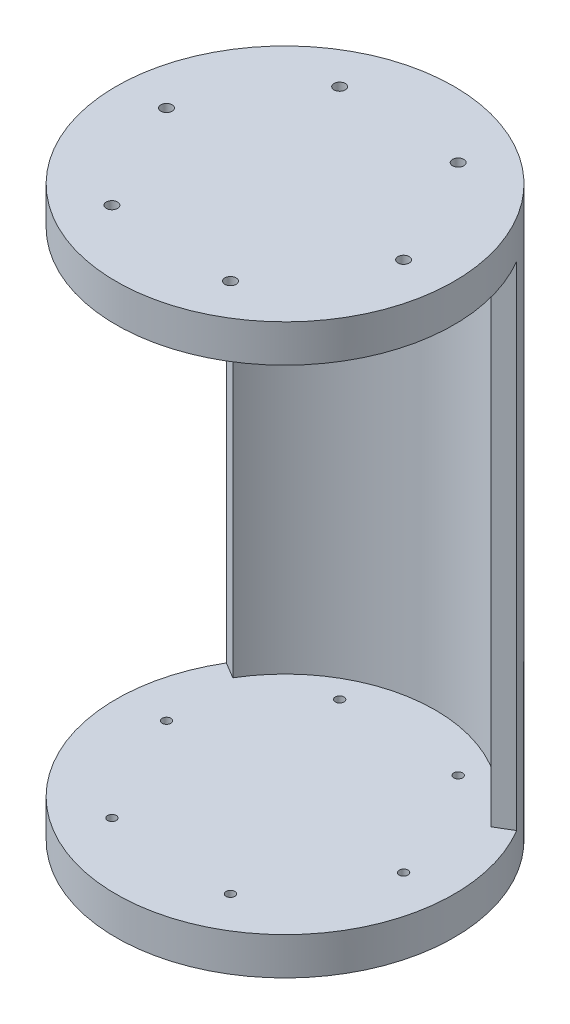
ISO-10303-21;
HEADER;
FILE_DESCRIPTION(('STEP AP214'),'2;1');
FILE_NAME('part.step','',(''),(''),'','','');
FILE_SCHEMA(('AUTOMOTIVE_DESIGN { 1 0 10303 214 1 1 1 1 }'));
ENDSEC;
DATA;
#1=APPLICATION_CONTEXT('core data for automotive mechanical design processes');
#2=APPLICATION_PROTOCOL_DEFINITION('international standard','automotive_design',2000,#1);
#3=PRODUCT_CONTEXT('',#1,'mechanical');
#4=PRODUCT('Part','Part','',(#3));
#5=PRODUCT_RELATED_PRODUCT_CATEGORY('part','',(#4));
#6=PRODUCT_DEFINITION_FORMATION('','',#4);
#7=PRODUCT_DEFINITION_CONTEXT('part definition',#1,'design');
#8=PRODUCT_DEFINITION('design','',#6,#7);
#9=PRODUCT_DEFINITION_SHAPE('','',#8);
#10=(LENGTH_UNIT() NAMED_UNIT(*) SI_UNIT(.MILLI.,.METRE.));
#11=(NAMED_UNIT(*) PLANE_ANGLE_UNIT() SI_UNIT($,.RADIAN.));
#12=(NAMED_UNIT(*) SI_UNIT($,.STERADIAN.) SOLID_ANGLE_UNIT());
#13=UNCERTAINTY_MEASURE_WITH_UNIT(LENGTH_MEASURE(1.E-05),#10,'distance_accuracy_value','');
#14=(GEOMETRIC_REPRESENTATION_CONTEXT(3) GLOBAL_UNCERTAINTY_ASSIGNED_CONTEXT((#13)) GLOBAL_UNIT_ASSIGNED_CONTEXT((#10,
#11,#12)) REPRESENTATION_CONTEXT('',''));
#15=CARTESIAN_POINT('',(0.,0.,0.));
#16=DIRECTION('',(0.,0.,1.));
#17=DIRECTION('',(1.,0.,0.));
#18=AXIS2_PLACEMENT_3D('',#15,#16,#17);
#19=CARTESIAN_POINT('',(0.,197.,0.));
#20=DIRECTION('',(-0.511664206442225,0.,-0.859185509564639));
#21=DIRECTION('',(-0.859185509564639,0.,0.511664206442225));
#22=AXIS2_PLACEMENT_3D('',#19,#20,#21);
#23=PLANE('',#22);
#24=DIRECTION('',(0.859185509564639,0.,-0.511664206442225));
#25=VECTOR('',#24,1.);
#26=CARTESIAN_POINT('',(0.,0.,0.));
#27=LINE('',#26,#25);
#28=CARTESIAN_POINT('',(51.5511305738783,0.,-30.6998523865335));
#29=VERTEX_POINT('',#28);
#30=CARTESIAN_POINT('',(57.9950218956131,0.,-34.5373339348502));
#31=VERTEX_POINT('',#30);
#32=EDGE_CURVE('E87',#29,#31,#27,.T.);
#33=ORIENTED_EDGE('',*,*,#32,.T.);
#34=DIRECTION('',(0.,-1.,0.));
#35=VECTOR('',#34,1.);
#36=CARTESIAN_POINT('',(57.9950218956131,197.,-34.5373339348502));
#37=LINE('',#36,#35);
#38=CARTESIAN_POINT('',(57.9950218956131,197.,-34.5373339348502));
#39=VERTEX_POINT('',#38);
#40=EDGE_CURVE('E11',#39,#31,#37,.T.);
#41=ORIENTED_EDGE('',*,*,#40,.F.);
#42=DIRECTION('',(0.859185509564639,0.,-0.511664206442225));
#43=VECTOR('',#42,1.);
#44=CARTESIAN_POINT('',(0.,197.,0.));
#45=LINE('',#44,#43);
#46=CARTESIAN_POINT('',(51.5511305738783,197.,-30.6998523865335));
#47=VERTEX_POINT('',#46);
#48=EDGE_CURVE('E91',#47,#39,#45,.T.);
#49=ORIENTED_EDGE('',*,*,#48,.F.);
#50=DIRECTION('',(0.,-1.,0.));
#51=VECTOR('',#50,1.);
#52=CARTESIAN_POINT('',(51.5511305738783,197.,-30.6998523865335));
#53=LINE('',#52,#51);
#54=EDGE_CURVE('E77',#47,#29,#53,.T.);
#55=ORIENTED_EDGE('',*,*,#54,.T.);
#56=EDGE_LOOP('',(#33,#41,#49,#55));
#57=FACE_BOUND('',#56,.T.);
#58=ADVANCED_FACE('F38',(#57),#23,.F.);
#59=CARTESIAN_POINT('',(0.,197.,0.));
#60=DIRECTION('',(0.,-1.,0.));
#61=DIRECTION('',(0.,0.,-1.));
#62=AXIS2_PLACEMENT_3D('',#59,#60,#61);
#63=CYLINDRICAL_SURFACE('',#62,67.5);
#64=CARTESIAN_POINT('',(0.,0.,0.));
#65=DIRECTION('',(0.,-1.,0.));
#66=DIRECTION('',(0.,0.,-1.));
#67=AXIS2_PLACEMENT_3D('',#64,#65,#66);
#68=CIRCLE('',#67,67.5);
#69=CARTESIAN_POINT('',(-57.9950218956131,0.,-34.5373339348502));
#70=VERTEX_POINT('',#69);
#71=EDGE_CURVE('E211',#31,#70,#68,.T.);
#72=ORIENTED_EDGE('',*,*,#71,.T.);
#73=DIRECTION('',(0.,-1.,0.));
#74=VECTOR('',#73,1.);
#75=CARTESIAN_POINT('',(-57.9950218956131,197.,-34.5373339348502));
#76=LINE('',#75,#74);
#77=CARTESIAN_POINT('',(-57.9950218956131,197.,-34.5373339348502));
#78=VERTEX_POINT('',#77);
#79=EDGE_CURVE('E47',#78,#70,#76,.T.);
#80=ORIENTED_EDGE('',*,*,#79,.F.);
#81=CARTESIAN_POINT('',(0.,197.,0.));
#82=DIRECTION('',(0.,-1.,0.));
#83=DIRECTION('',(0.,0.,-1.));
#84=AXIS2_PLACEMENT_3D('',#81,#82,#83);
#85=CIRCLE('',#84,67.5);
#86=EDGE_CURVE('E152',#39,#78,#85,.T.);
#87=ORIENTED_EDGE('',*,*,#86,.F.);
#88=ORIENTED_EDGE('',*,*,#40,.T.);
#89=EDGE_LOOP('',(#72,#80,#87,#88));
#90=FACE_BOUND('',#89,.T.);
#91=CARTESIAN_POINT('',(0.,-15.,0.));
#92=DIRECTION('',(0.,-1.,0.));
#93=DIRECTION('',(0.,0.,-1.));
#94=AXIS2_PLACEMENT_3D('',#91,#92,#93);
#95=CIRCLE('',#94,67.5);
#96=CARTESIAN_POINT('',(0.,-15.,-67.5));
#97=VERTEX_POINT('',#96);
#98=EDGE_CURVE('E214',#97,#97,#95,.T.);
#99=ORIENTED_EDGE('',*,*,#98,.F.);
#100=EDGE_LOOP('',(#99));
#101=FACE_BOUND('',#100,.T.);
#102=CARTESIAN_POINT('',(0.,212.,0.));
#103=DIRECTION('',(0.,-1.,0.));
#104=DIRECTION('',(0.,0.,-1.));
#105=AXIS2_PLACEMENT_3D('',#102,#103,#104);
#106=CIRCLE('',#105,67.5);
#107=CARTESIAN_POINT('',(0.,212.,-67.5));
#108=VERTEX_POINT('',#107);
#109=EDGE_CURVE('E157',#108,#108,#106,.T.);
#110=ORIENTED_EDGE('',*,*,#109,.T.);
#111=EDGE_LOOP('',(#110));
#112=FACE_BOUND('',#111,.T.);
#113=ADVANCED_FACE('F224',(#90,#101,#112),#63,.T.);
#114=CARTESIAN_POINT('',(0.,197.,0.));
#115=DIRECTION('',(-0.511664206442225,0.,0.859185509564639));
#116=DIRECTION('',(0.859185509564639,0.,0.511664206442225));
#117=AXIS2_PLACEMENT_3D('',#114,#115,#116);
#118=PLANE('',#117);
#119=DIRECTION('',(-0.859185509564639,0.,-0.511664206442225));
#120=VECTOR('',#119,1.);
#121=CARTESIAN_POINT('',(0.,0.,0.));
#122=LINE('',#121,#120);
#123=CARTESIAN_POINT('',(-51.5511305738783,0.,-30.6998523865335));
#124=VERTEX_POINT('',#123);
#125=EDGE_CURVE('E81',#124,#70,#122,.T.);
#126=ORIENTED_EDGE('',*,*,#125,.F.);
#127=DIRECTION('',(0.,-1.,0.));
#128=VECTOR('',#127,1.);
#129=CARTESIAN_POINT('',(-51.5511305738783,197.,-30.6998523865335));
#130=LINE('',#129,#128);
#131=CARTESIAN_POINT('',(-51.5511305738783,197.,-30.6998523865335));
#132=VERTEX_POINT('',#131);
#133=EDGE_CURVE('E68',#132,#124,#130,.T.);
#134=ORIENTED_EDGE('',*,*,#133,.F.);
#135=DIRECTION('',(-0.859185509564639,0.,-0.511664206442225));
#136=VECTOR('',#135,1.);
#137=CARTESIAN_POINT('',(0.,197.,0.));
#138=LINE('',#137,#136);
#139=EDGE_CURVE('E55',#132,#78,#138,.T.);
#140=ORIENTED_EDGE('',*,*,#139,.T.);
#141=ORIENTED_EDGE('',*,*,#79,.T.);
#142=EDGE_LOOP('',(#126,#134,#140,#141));
#143=FACE_BOUND('',#142,.T.);
#144=ADVANCED_FACE('F82',(#143),#118,.T.);
#145=CARTESIAN_POINT('',(0.,197.,0.));
#146=DIRECTION('',(0.,-1.,0.));
#147=DIRECTION('',(0.,0.,-1.));
#148=AXIS2_PLACEMENT_3D('',#145,#146,#147);
#149=CYLINDRICAL_SURFACE('',#148,60.);
#150=CARTESIAN_POINT('',(0.,0.,0.));
#151=DIRECTION('',(0.,1.,0.));
#152=DIRECTION('',(0.,0.,1.));
#153=AXIS2_PLACEMENT_3D('',#150,#151,#152);
#154=CIRCLE('',#153,60.);
#155=EDGE_CURVE('E73',#29,#124,#154,.T.);
#156=ORIENTED_EDGE('',*,*,#155,.F.);
#157=ORIENTED_EDGE('',*,*,#54,.F.);
#158=CARTESIAN_POINT('',(0.,197.,0.));
#159=DIRECTION('',(0.,1.,0.));
#160=DIRECTION('',(0.,0.,1.));
#161=AXIS2_PLACEMENT_3D('',#158,#159,#160);
#162=CIRCLE('',#161,60.);
#163=EDGE_CURVE('E75',#47,#132,#162,.T.);
#164=ORIENTED_EDGE('',*,*,#163,.T.);
#165=ORIENTED_EDGE('',*,*,#133,.T.);
#166=EDGE_LOOP('',(#156,#157,#164,#165));
#167=FACE_BOUND('',#166,.T.);
#168=ADVANCED_FACE('F70',(#167),#149,.F.);
#169=CARTESIAN_POINT('',(0.,-15.,0.));
#170=DIRECTION('',(0.,-1.,0.));
#171=DIRECTION('',(0.,0.,-1.));
#172=AXIS2_PLACEMENT_3D('',#169,#170,#171);
#173=PLANE('',#172);
#174=CARTESIAN_POINT('',(-27.20568798596,-15.,41.9505725969314));
#175=DIRECTION('',(0.,-1.,0.));
#176=DIRECTION('',(0.,0.,-1.));
#177=AXIS2_PLACEMENT_3D('',#174,#175,#176);
#178=CIRCLE('',#177,2.25);
#179=CARTESIAN_POINT('',(-27.20568798596,-15.,39.7005725969314));
#180=VERTEX_POINT('',#179);
#181=EDGE_CURVE('E118',#180,#180,#178,.T.);
#182=ORIENTED_EDGE('',*,*,#181,.F.);
#183=EDGE_LOOP('',(#182));
#184=FACE_BOUND('',#183,.T.);
#185=CARTESIAN_POINT('',(-49.9331055652258,-15.,-2.58553062481088));
#186=DIRECTION('',(0.,-1.,0.));
#187=DIRECTION('',(0.,0.,-1.));
#188=AXIS2_PLACEMENT_3D('',#185,#186,#187);
#189=CIRCLE('',#188,2.25);
#190=CARTESIAN_POINT('',(-49.9331055652258,-15.,-4.83553062481088));
#191=VERTEX_POINT('',#190);
#192=EDGE_CURVE('E200',#191,#191,#189,.T.);
#193=ORIENTED_EDGE('',*,*,#192,.F.);
#194=EDGE_LOOP('',(#193));
#195=FACE_BOUND('',#194,.T.);
#196=CARTESIAN_POINT('',(-22.727417579264,-15.,-44.5361032217432));
#197=DIRECTION('',(0.,-1.,0.));
#198=DIRECTION('',(0.,0.,-1.));
#199=AXIS2_PLACEMENT_3D('',#196,#197,#198);
#200=CIRCLE('',#199,2.25);
#201=CARTESIAN_POINT('',(-22.727417579264,-15.,-46.7861032217432));
#202=VERTEX_POINT('',#201);
#203=EDGE_CURVE('E194',#202,#202,#200,.T.);
#204=ORIENTED_EDGE('',*,*,#203,.F.);
#205=EDGE_LOOP('',(#204));
#206=FACE_BOUND('',#205,.T.);
#207=CARTESIAN_POINT('',(27.2056879859637,-15.,-41.9505725969333));
#208=DIRECTION('',(0.,-1.,0.));
#209=DIRECTION('',(0.,0.,-1.));
#210=AXIS2_PLACEMENT_3D('',#207,#208,#209);
#211=CIRCLE('',#210,2.25);
#212=CARTESIAN_POINT('',(27.2056879859637,-15.,-44.2005725969333));
#213=VERTEX_POINT('',#212);
#214=EDGE_CURVE('E188',#213,#213,#211,.T.);
#215=ORIENTED_EDGE('',*,*,#214,.F.);
#216=EDGE_LOOP('',(#215));
#217=FACE_BOUND('',#216,.T.);
#218=CARTESIAN_POINT('',(49.9331055652296,-15.,2.58553062480892));
#219=DIRECTION('',(0.,-1.,0.));
#220=DIRECTION('',(0.,0.,-1.));
#221=AXIS2_PLACEMENT_3D('',#218,#219,#220);
#222=CIRCLE('',#221,2.25);
#223=CARTESIAN_POINT('',(49.9331055652296,-15.,0.335530624808916));
#224=VERTEX_POINT('',#223);
#225=EDGE_CURVE('E182',#224,#224,#222,.T.);
#226=ORIENTED_EDGE('',*,*,#225,.F.);
#227=EDGE_LOOP('',(#226));
#228=FACE_BOUND('',#227,.T.);
#229=CARTESIAN_POINT('',(22.7274175792677,-15.,44.5361032217413));
#230=DIRECTION('',(0.,-1.,0.));
#231=DIRECTION('',(0.,0.,-1.));
#232=AXIS2_PLACEMENT_3D('',#229,#230,#231);
#233=CIRCLE('',#232,2.25);
#234=CARTESIAN_POINT('',(22.7274175792677,-15.,42.2861032217413));
#235=VERTEX_POINT('',#234);
#236=EDGE_CURVE('E181',#235,#235,#233,.T.);
#237=ORIENTED_EDGE('',*,*,#236,.F.);
#238=EDGE_LOOP('',(#237));
#239=FACE_BOUND('',#238,.T.);
#240=ORIENTED_EDGE('',*,*,#98,.T.);
#241=EDGE_LOOP('',(#240));
#242=FACE_BOUND('',#241,.T.);
#243=ADVANCED_FACE('F259',(#184,#195,#206,#217,#228,#239,#242),#173,.T.);
#244=CARTESIAN_POINT('',(0.,0.,0.));
#245=DIRECTION('',(0.,-1.,0.));
#246=DIRECTION('',(0.,0.,-1.));
#247=AXIS2_PLACEMENT_3D('',#244,#245,#246);
#248=PLANE('',#247);
#249=CARTESIAN_POINT('',(-27.20568798596,0.,41.9505725969314));
#250=DIRECTION('',(0.,-1.,0.));
#251=DIRECTION('',(0.,0.,-1.));
#252=AXIS2_PLACEMENT_3D('',#249,#250,#251);
#253=CIRCLE('',#252,1.75000000000249);
#254=CARTESIAN_POINT('',(-27.20568798596,0.,40.2005725969289));
#255=VERTEX_POINT('',#254);
#256=EDGE_CURVE('E115',#255,#255,#253,.T.);
#257=ORIENTED_EDGE('',*,*,#256,.T.);
#258=EDGE_LOOP('',(#257));
#259=FACE_BOUND('',#258,.T.);
#260=CARTESIAN_POINT('',(-49.9331055652258,0.,-2.58553062481088));
#261=DIRECTION('',(0.,-1.,0.));
#262=DIRECTION('',(0.,0.,-1.));
#263=AXIS2_PLACEMENT_3D('',#260,#261,#262);
#264=CIRCLE('',#263,1.75000000000391);
#265=CARTESIAN_POINT('',(-49.9331055652258,0.,-4.33553062481479));
#266=VERTEX_POINT('',#265);
#267=EDGE_CURVE('E112',#266,#266,#264,.T.);
#268=ORIENTED_EDGE('',*,*,#267,.T.);
#269=EDGE_LOOP('',(#268));
#270=FACE_BOUND('',#269,.T.);
#271=CARTESIAN_POINT('',(-22.727417579264,0.,-44.5361032217432));
#272=DIRECTION('',(0.,-1.,0.));
#273=DIRECTION('',(0.,0.,-1.));
#274=AXIS2_PLACEMENT_3D('',#271,#272,#273);
#275=CIRCLE('',#274,1.75000000000327);
#276=CARTESIAN_POINT('',(-22.727417579264,0.,-46.2861032217465));
#277=VERTEX_POINT('',#276);
#278=EDGE_CURVE('E109',#277,#277,#275,.T.);
#279=ORIENTED_EDGE('',*,*,#278,.T.);
#280=EDGE_LOOP('',(#279));
#281=FACE_BOUND('',#280,.T.);
#282=CARTESIAN_POINT('',(27.2056879859637,0.,-41.9505725969333));
#283=DIRECTION('',(0.,-1.,0.));
#284=DIRECTION('',(0.,0.,-1.));
#285=AXIS2_PLACEMENT_3D('',#282,#283,#284);
#286=CIRCLE('',#285,1.75000000000115);
#287=CARTESIAN_POINT('',(27.2056879859637,0.,-43.7005725969345));
#288=VERTEX_POINT('',#287);
#289=EDGE_CURVE('E106',#288,#288,#286,.T.);
#290=ORIENTED_EDGE('',*,*,#289,.T.);
#291=EDGE_LOOP('',(#290));
#292=FACE_BOUND('',#291,.T.);
#293=CARTESIAN_POINT('',(49.9331055652296,0.,2.58553062480892));
#294=DIRECTION('',(0.,-1.,0.));
#295=DIRECTION('',(0.,0.,-1.));
#296=AXIS2_PLACEMENT_3D('',#293,#294,#295);
#297=CIRCLE('',#296,1.74999999999956);
#298=CARTESIAN_POINT('',(49.9331055652296,0.,0.835530624809363));
#299=VERTEX_POINT('',#298);
#300=EDGE_CURVE('E102',#299,#299,#297,.T.);
#301=ORIENTED_EDGE('',*,*,#300,.T.);
#302=EDGE_LOOP('',(#301));
#303=FACE_BOUND('',#302,.T.);
#304=CARTESIAN_POINT('',(22.7274175792677,0.,44.5361032217413));
#305=DIRECTION('',(0.,-1.,0.));
#306=DIRECTION('',(0.,0.,-1.));
#307=AXIS2_PLACEMENT_3D('',#304,#305,#306);
#308=CIRCLE('',#307,1.75);
#309=CARTESIAN_POINT('',(22.7274175792677,0.,42.7861032217413));
#310=VERTEX_POINT('',#309);
#311=EDGE_CURVE('E99',#310,#310,#308,.T.);
#312=ORIENTED_EDGE('',*,*,#311,.T.);
#313=EDGE_LOOP('',(#312));
#314=FACE_BOUND('',#313,.T.);
#315=ORIENTED_EDGE('',*,*,#32,.F.);
#316=ORIENTED_EDGE('',*,*,#155,.T.);
#317=ORIENTED_EDGE('',*,*,#125,.T.);
#318=ORIENTED_EDGE('',*,*,#71,.F.);
#319=EDGE_LOOP('',(#315,#316,#317,#318));
#320=FACE_BOUND('',#319,.T.);
#321=ADVANCED_FACE('F89',(#259,#270,#281,#292,#303,#314,#320),#248,.F.);
#322=CARTESIAN_POINT('',(22.7274175792677,-5.,44.5361032217413));
#323=DIRECTION('',(0.,-1.,0.));
#324=DIRECTION('',(0.,0.,-1.));
#325=AXIS2_PLACEMENT_3D('',#322,#323,#324);
#326=CYLINDRICAL_SURFACE('',#325,2.25);
#327=CARTESIAN_POINT('',(22.7274175792677,-5.,44.5361032217413));
#328=DIRECTION('',(0.,-1.,0.));
#329=DIRECTION('',(0.,0.,-1.));
#330=AXIS2_PLACEMENT_3D('',#327,#328,#329);
#331=CIRCLE('',#330,2.25);
#332=CARTESIAN_POINT('',(22.7274175792677,-5.,42.2861032217413));
#333=VERTEX_POINT('',#332);
#334=EDGE_CURVE('E208',#333,#333,#331,.T.);
#335=ORIENTED_EDGE('',*,*,#334,.F.);
#336=EDGE_LOOP('',(#335));
#337=FACE_BOUND('',#336,.T.);
#338=ORIENTED_EDGE('',*,*,#236,.T.);
#339=EDGE_LOOP('',(#338));
#340=FACE_BOUND('',#339,.T.);
#341=ADVANCED_FACE('F262',(#337,#340),#326,.F.);
#342=CARTESIAN_POINT('',(22.7274175792677,-5.,44.5361032217413));
#343=DIRECTION('',(0.,-1.,0.));
#344=DIRECTION('',(0.,0.,-1.));
#345=AXIS2_PLACEMENT_3D('',#342,#343,#344);
#346=PLANE('',#345);
#347=CARTESIAN_POINT('',(22.7274175792677,-5.,44.5361032217413));
#348=DIRECTION('',(0.,-1.,0.));
#349=DIRECTION('',(0.,0.,-1.));
#350=AXIS2_PLACEMENT_3D('',#347,#348,#349);
#351=CIRCLE('',#350,1.75);
#352=CARTESIAN_POINT('',(22.7274175792677,-5.,42.7861032217413));
#353=VERTEX_POINT('',#352);
#354=EDGE_CURVE('E103',#353,#353,#351,.T.);
#355=ORIENTED_EDGE('',*,*,#354,.F.);
#356=EDGE_LOOP('',(#355));
#357=FACE_BOUND('',#356,.T.);
#358=ORIENTED_EDGE('',*,*,#334,.T.);
#359=EDGE_LOOP('',(#358));
#360=FACE_BOUND('',#359,.T.);
#361=ADVANCED_FACE('F269',(#357,#360),#346,.T.);
#362=CARTESIAN_POINT('',(49.9331055652296,-5.,2.58553062480892));
#363=DIRECTION('',(0.,-1.,0.));
#364=DIRECTION('',(0.,0.,-1.));
#365=AXIS2_PLACEMENT_3D('',#362,#363,#364);
#366=CYLINDRICAL_SURFACE('',#365,2.25);
#367=CARTESIAN_POINT('',(49.9331055652296,-5.,2.58553062480892));
#368=DIRECTION('',(0.,-1.,0.));
#369=DIRECTION('',(0.,0.,-1.));
#370=AXIS2_PLACEMENT_3D('',#367,#368,#369);
#371=CIRCLE('',#370,2.25);
#372=CARTESIAN_POINT('',(49.9331055652296,-5.,0.335530624808916));
#373=VERTEX_POINT('',#372);
#374=EDGE_CURVE('E178',#373,#373,#371,.T.);
#375=ORIENTED_EDGE('',*,*,#374,.F.);
#376=EDGE_LOOP('',(#375));
#377=FACE_BOUND('',#376,.T.);
#378=ORIENTED_EDGE('',*,*,#225,.T.);
#379=EDGE_LOOP('',(#378));
#380=FACE_BOUND('',#379,.T.);
#381=ADVANCED_FACE('F273',(#377,#380),#366,.F.);
#382=CARTESIAN_POINT('',(49.9331055652296,-5.,2.58553062480892));
#383=DIRECTION('',(0.,-1.,0.));
#384=DIRECTION('',(0.,0.,-1.));
#385=AXIS2_PLACEMENT_3D('',#382,#383,#384);
#386=PLANE('',#385);
#387=CARTESIAN_POINT('',(49.9331055652296,-5.,2.58553062480892));
#388=DIRECTION('',(0.,-1.,0.));
#389=DIRECTION('',(0.,0.,-1.));
#390=AXIS2_PLACEMENT_3D('',#387,#388,#389);
#391=CIRCLE('',#390,1.74999999999956);
#392=CARTESIAN_POINT('',(49.9331055652296,-5.,0.835530624809363));
#393=VERTEX_POINT('',#392);
#394=EDGE_CURVE('E162',#393,#393,#391,.T.);
#395=ORIENTED_EDGE('',*,*,#394,.F.);
#396=EDGE_LOOP('',(#395));
#397=FACE_BOUND('',#396,.T.);
#398=ORIENTED_EDGE('',*,*,#374,.T.);
#399=EDGE_LOOP('',(#398));
#400=FACE_BOUND('',#399,.T.);
#401=ADVANCED_FACE('F304',(#397,#400),#386,.T.);
#402=CARTESIAN_POINT('',(27.2056879859637,-5.,-41.9505725969333));
#403=DIRECTION('',(0.,-1.,0.));
#404=DIRECTION('',(0.,0.,-1.));
#405=AXIS2_PLACEMENT_3D('',#402,#403,#404);
#406=CYLINDRICAL_SURFACE('',#405,2.25);
#407=CARTESIAN_POINT('',(27.2056879859637,-5.,-41.9505725969333));
#408=DIRECTION('',(0.,-1.,0.));
#409=DIRECTION('',(0.,0.,-1.));
#410=AXIS2_PLACEMENT_3D('',#407,#408,#409);
#411=CIRCLE('',#410,2.25);
#412=CARTESIAN_POINT('',(27.2056879859637,-5.,-44.2005725969333));
#413=VERTEX_POINT('',#412);
#414=EDGE_CURVE('E185',#413,#413,#411,.T.);
#415=ORIENTED_EDGE('',*,*,#414,.F.);
#416=EDGE_LOOP('',(#415));
#417=FACE_BOUND('',#416,.T.);
#418=ORIENTED_EDGE('',*,*,#214,.T.);
#419=EDGE_LOOP('',(#418));
#420=FACE_BOUND('',#419,.T.);
#421=ADVANCED_FACE('F301',(#417,#420),#406,.F.);
#422=CARTESIAN_POINT('',(27.2056879859637,-5.,-41.9505725969333));
#423=DIRECTION('',(0.,-1.,0.));
#424=DIRECTION('',(0.,0.,-1.));
#425=AXIS2_PLACEMENT_3D('',#422,#423,#424);
#426=PLANE('',#425);
#427=CARTESIAN_POINT('',(27.2056879859637,-5.,-41.9505725969333));
#428=DIRECTION('',(0.,-1.,0.));
#429=DIRECTION('',(0.,0.,-1.));
#430=AXIS2_PLACEMENT_3D('',#427,#428,#429);
#431=CIRCLE('',#430,1.75000000000115);
#432=CARTESIAN_POINT('',(27.2056879859637,-5.,-43.7005725969345));
#433=VERTEX_POINT('',#432);
#434=EDGE_CURVE('E165',#433,#433,#431,.T.);
#435=ORIENTED_EDGE('',*,*,#434,.F.);
#436=EDGE_LOOP('',(#435));
#437=FACE_BOUND('',#436,.T.);
#438=ORIENTED_EDGE('',*,*,#414,.T.);
#439=EDGE_LOOP('',(#438));
#440=FACE_BOUND('',#439,.T.);
#441=ADVANCED_FACE('F296',(#437,#440),#426,.T.);
#442=CARTESIAN_POINT('',(-22.727417579264,-5.,-44.5361032217432));
#443=DIRECTION('',(0.,-1.,0.));
#444=DIRECTION('',(0.,0.,-1.));
#445=AXIS2_PLACEMENT_3D('',#442,#443,#444);
#446=CYLINDRICAL_SURFACE('',#445,2.25);
#447=CARTESIAN_POINT('',(-22.727417579264,-5.,-44.5361032217432));
#448=DIRECTION('',(0.,-1.,0.));
#449=DIRECTION('',(0.,0.,-1.));
#450=AXIS2_PLACEMENT_3D('',#447,#448,#449);
#451=CIRCLE('',#450,2.25);
#452=CARTESIAN_POINT('',(-22.727417579264,-5.,-46.7861032217432));
#453=VERTEX_POINT('',#452);
#454=EDGE_CURVE('E191',#453,#453,#451,.T.);
#455=ORIENTED_EDGE('',*,*,#454,.F.);
#456=EDGE_LOOP('',(#455));
#457=FACE_BOUND('',#456,.T.);
#458=ORIENTED_EDGE('',*,*,#203,.T.);
#459=EDGE_LOOP('',(#458));
#460=FACE_BOUND('',#459,.T.);
#461=ADVANCED_FACE('F293',(#457,#460),#446,.F.);
#462=CARTESIAN_POINT('',(-22.727417579264,-5.,-44.5361032217432));
#463=DIRECTION('',(0.,-1.,0.));
#464=DIRECTION('',(0.,0.,-1.));
#465=AXIS2_PLACEMENT_3D('',#462,#463,#464);
#466=PLANE('',#465);
#467=CARTESIAN_POINT('',(-22.727417579264,-5.,-44.5361032217432));
#468=DIRECTION('',(0.,-1.,0.));
#469=DIRECTION('',(0.,0.,-1.));
#470=AXIS2_PLACEMENT_3D('',#467,#468,#469);
#471=CIRCLE('',#470,1.75000000000327);
#472=CARTESIAN_POINT('',(-22.727417579264,-5.,-46.2861032217465));
#473=VERTEX_POINT('',#472);
#474=EDGE_CURVE('E168',#473,#473,#471,.T.);
#475=ORIENTED_EDGE('',*,*,#474,.F.);
#476=EDGE_LOOP('',(#475));
#477=FACE_BOUND('',#476,.T.);
#478=ORIENTED_EDGE('',*,*,#454,.T.);
#479=EDGE_LOOP('',(#478));
#480=FACE_BOUND('',#479,.T.);
#481=ADVANCED_FACE('F288',(#477,#480),#466,.T.);
#482=CARTESIAN_POINT('',(-49.9331055652258,-5.,-2.58553062481088));
#483=DIRECTION('',(0.,-1.,0.));
#484=DIRECTION('',(0.,0.,-1.));
#485=AXIS2_PLACEMENT_3D('',#482,#483,#484);
#486=CYLINDRICAL_SURFACE('',#485,2.25);
#487=CARTESIAN_POINT('',(-49.9331055652258,-5.,-2.58553062481088));
#488=DIRECTION('',(0.,-1.,0.));
#489=DIRECTION('',(0.,0.,-1.));
#490=AXIS2_PLACEMENT_3D('',#487,#488,#489);
#491=CIRCLE('',#490,2.25);
#492=CARTESIAN_POINT('',(-49.9331055652258,-5.,-4.83553062481088));
#493=VERTEX_POINT('',#492);
#494=EDGE_CURVE('E197',#493,#493,#491,.T.);
#495=ORIENTED_EDGE('',*,*,#494,.F.);
#496=EDGE_LOOP('',(#495));
#497=FACE_BOUND('',#496,.T.);
#498=ORIENTED_EDGE('',*,*,#192,.T.);
#499=EDGE_LOOP('',(#498));
#500=FACE_BOUND('',#499,.T.);
#501=ADVANCED_FACE('F285',(#497,#500),#486,.F.);
#502=CARTESIAN_POINT('',(-49.9331055652258,-5.,-2.58553062481088));
#503=DIRECTION('',(0.,-1.,0.));
#504=DIRECTION('',(0.,0.,-1.));
#505=AXIS2_PLACEMENT_3D('',#502,#503,#504);
#506=PLANE('',#505);
#507=CARTESIAN_POINT('',(-49.9331055652258,-5.,-2.58553062481088));
#508=DIRECTION('',(0.,-1.,0.));
#509=DIRECTION('',(0.,0.,-1.));
#510=AXIS2_PLACEMENT_3D('',#507,#508,#509);
#511=CIRCLE('',#510,1.75000000000391);
#512=CARTESIAN_POINT('',(-49.9331055652258,-5.,-4.33553062481479));
#513=VERTEX_POINT('',#512);
#514=EDGE_CURVE('E171',#513,#513,#511,.T.);
#515=ORIENTED_EDGE('',*,*,#514,.F.);
#516=EDGE_LOOP('',(#515));
#517=FACE_BOUND('',#516,.T.);
#518=ORIENTED_EDGE('',*,*,#494,.T.);
#519=EDGE_LOOP('',(#518));
#520=FACE_BOUND('',#519,.T.);
#521=ADVANCED_FACE('F279',(#517,#520),#506,.T.);
#522=CARTESIAN_POINT('',(-27.20568798596,-5.,41.9505725969314));
#523=DIRECTION('',(0.,-1.,0.));
#524=DIRECTION('',(0.,0.,-1.));
#525=AXIS2_PLACEMENT_3D('',#522,#523,#524);
#526=CYLINDRICAL_SURFACE('',#525,2.25);
#527=CARTESIAN_POINT('',(-27.20568798596,-5.,41.9505725969314));
#528=DIRECTION('',(0.,-1.,0.));
#529=DIRECTION('',(0.,0.,-1.));
#530=AXIS2_PLACEMENT_3D('',#527,#528,#529);
#531=CIRCLE('',#530,2.25);
#532=CARTESIAN_POINT('',(-27.20568798596,-5.,39.7005725969314));
#533=VERTEX_POINT('',#532);
#534=EDGE_CURVE('E203',#533,#533,#531,.T.);
#535=ORIENTED_EDGE('',*,*,#534,.F.);
#536=EDGE_LOOP('',(#535));
#537=FACE_BOUND('',#536,.T.);
#538=ORIENTED_EDGE('',*,*,#181,.T.);
#539=EDGE_LOOP('',(#538));
#540=FACE_BOUND('',#539,.T.);
#541=ADVANCED_FACE('F275',(#537,#540),#526,.F.);
#542=CARTESIAN_POINT('',(-27.20568798596,-5.,41.9505725969314));
#543=DIRECTION('',(0.,-1.,0.));
#544=DIRECTION('',(0.,0.,-1.));
#545=AXIS2_PLACEMENT_3D('',#542,#543,#544);
#546=PLANE('',#545);
#547=CARTESIAN_POINT('',(-27.20568798596,-5.,41.9505725969314));
#548=DIRECTION('',(0.,-1.,0.));
#549=DIRECTION('',(0.,0.,-1.));
#550=AXIS2_PLACEMENT_3D('',#547,#548,#549);
#551=CIRCLE('',#550,1.75000000000249);
#552=CARTESIAN_POINT('',(-27.20568798596,-5.,40.2005725969289));
#553=VERTEX_POINT('',#552);
#554=EDGE_CURVE('E160',#553,#553,#551,.T.);
#555=ORIENTED_EDGE('',*,*,#554,.F.);
#556=EDGE_LOOP('',(#555));
#557=FACE_BOUND('',#556,.T.);
#558=ORIENTED_EDGE('',*,*,#534,.T.);
#559=EDGE_LOOP('',(#558));
#560=FACE_BOUND('',#559,.T.);
#561=ADVANCED_FACE('F278',(#557,#560),#546,.T.);
#562=CARTESIAN_POINT('',(22.7274175792677,9.,44.5361032217413));
#563=DIRECTION('',(0.,-1.,0.));
#564=DIRECTION('',(0.,0.,-1.));
#565=AXIS2_PLACEMENT_3D('',#562,#563,#564);
#566=CYLINDRICAL_SURFACE('',#565,1.75);
#567=ORIENTED_EDGE('',*,*,#354,.T.);
#568=EDGE_LOOP('',(#567));
#569=FACE_BOUND('',#568,.T.);
#570=ORIENTED_EDGE('',*,*,#311,.F.);
#571=EDGE_LOOP('',(#570));
#572=FACE_BOUND('',#571,.T.);
#573=ADVANCED_FACE('F283',(#569,#572),#566,.F.);
#574=CARTESIAN_POINT('',(49.9331055652296,9.,2.58553062480892));
#575=DIRECTION('',(0.,-1.,0.));
#576=DIRECTION('',(0.,0.,-1.));
#577=AXIS2_PLACEMENT_3D('',#574,#575,#576);
#578=CYLINDRICAL_SURFACE('',#577,1.74999999999956);
#579=ORIENTED_EDGE('',*,*,#394,.T.);
#580=EDGE_LOOP('',(#579));
#581=FACE_BOUND('',#580,.T.);
#582=ORIENTED_EDGE('',*,*,#300,.F.);
#583=EDGE_LOOP('',(#582));
#584=FACE_BOUND('',#583,.T.);
#585=ADVANCED_FACE('F317',(#581,#584),#578,.F.);
#586=CARTESIAN_POINT('',(27.2056879859637,9.,-41.9505725969333));
#587=DIRECTION('',(0.,-1.,0.));
#588=DIRECTION('',(0.,0.,-1.));
#589=AXIS2_PLACEMENT_3D('',#586,#587,#588);
#590=CYLINDRICAL_SURFACE('',#589,1.75000000000115);
#591=ORIENTED_EDGE('',*,*,#434,.T.);
#592=EDGE_LOOP('',(#591));
#593=FACE_BOUND('',#592,.T.);
#594=ORIENTED_EDGE('',*,*,#289,.F.);
#595=EDGE_LOOP('',(#594));
#596=FACE_BOUND('',#595,.T.);
#597=ADVANCED_FACE('F329',(#593,#596),#590,.F.);
#598=CARTESIAN_POINT('',(-22.727417579264,9.,-44.5361032217432));
#599=DIRECTION('',(0.,-1.,0.));
#600=DIRECTION('',(0.,0.,-1.));
#601=AXIS2_PLACEMENT_3D('',#598,#599,#600);
#602=CYLINDRICAL_SURFACE('',#601,1.75000000000327);
#603=ORIENTED_EDGE('',*,*,#474,.T.);
#604=EDGE_LOOP('',(#603));
#605=FACE_BOUND('',#604,.T.);
#606=ORIENTED_EDGE('',*,*,#278,.F.);
#607=EDGE_LOOP('',(#606));
#608=FACE_BOUND('',#607,.T.);
#609=ADVANCED_FACE('F325',(#605,#608),#602,.F.);
#610=CARTESIAN_POINT('',(-49.9331055652258,9.,-2.58553062481088));
#611=DIRECTION('',(0.,-1.,0.));
#612=DIRECTION('',(0.,0.,-1.));
#613=AXIS2_PLACEMENT_3D('',#610,#611,#612);
#614=CYLINDRICAL_SURFACE('',#613,1.75000000000391);
#615=ORIENTED_EDGE('',*,*,#514,.T.);
#616=EDGE_LOOP('',(#615));
#617=FACE_BOUND('',#616,.T.);
#618=ORIENTED_EDGE('',*,*,#267,.F.);
#619=EDGE_LOOP('',(#618));
#620=FACE_BOUND('',#619,.T.);
#621=ADVANCED_FACE('F321',(#617,#620),#614,.F.);
#622=CARTESIAN_POINT('',(-27.20568798596,9.,41.9505725969314));
#623=DIRECTION('',(0.,-1.,0.));
#624=DIRECTION('',(0.,0.,-1.));
#625=AXIS2_PLACEMENT_3D('',#622,#623,#624);
#626=CYLINDRICAL_SURFACE('',#625,1.75000000000249);
#627=ORIENTED_EDGE('',*,*,#554,.T.);
#628=EDGE_LOOP('',(#627));
#629=FACE_BOUND('',#628,.T.);
#630=ORIENTED_EDGE('',*,*,#256,.F.);
#631=EDGE_LOOP('',(#630));
#632=FACE_BOUND('',#631,.T.);
#633=ADVANCED_FACE('F244',(#629,#632),#626,.F.);
#634=CARTESIAN_POINT('',(0.,212.,0.));
#635=DIRECTION('',(0.,1.,0.));
#636=DIRECTION('',(0.,0.,-1.));
#637=AXIS2_PLACEMENT_3D('',#634,#635,#636);
#638=PLANE('',#637);
#639=CARTESIAN_POINT('',(-27.20568798596,212.,41.9505725969314));
#640=DIRECTION('',(0.,-1.,0.));
#641=DIRECTION('',(0.,0.,-1.));
#642=AXIS2_PLACEMENT_3D('',#639,#640,#641);
#643=CIRCLE('',#642,2.25);
#644=CARTESIAN_POINT('',(-27.20568798596,212.,39.7005725969314));
#645=VERTEX_POINT('',#644);
#646=EDGE_CURVE('E136',#645,#645,#643,.T.);
#647=ORIENTED_EDGE('',*,*,#646,.T.);
#648=EDGE_LOOP('',(#647));
#649=FACE_BOUND('',#648,.T.);
#650=CARTESIAN_POINT('',(-49.9331055652258,212.,-2.58553062481088));
#651=DIRECTION('',(0.,-1.,0.));
#652=DIRECTION('',(0.,0.,-1.));
#653=AXIS2_PLACEMENT_3D('',#650,#651,#652);
#654=CIRCLE('',#653,2.25);
#655=CARTESIAN_POINT('',(-49.9331055652258,212.,-4.83553062481088));
#656=VERTEX_POINT('',#655);
#657=EDGE_CURVE('E145',#656,#656,#654,.T.);
#658=ORIENTED_EDGE('',*,*,#657,.T.);
#659=EDGE_LOOP('',(#658));
#660=FACE_BOUND('',#659,.T.);
#661=CARTESIAN_POINT('',(-22.727417579264,212.,-44.5361032217432));
#662=DIRECTION('',(0.,-1.,0.));
#663=DIRECTION('',(0.,0.,-1.));
#664=AXIS2_PLACEMENT_3D('',#661,#662,#663);
#665=CIRCLE('',#664,2.25);
#666=CARTESIAN_POINT('',(-22.727417579264,212.,-46.7861032217432));
#667=VERTEX_POINT('',#666);
#668=EDGE_CURVE('E594',#667,#667,#665,.T.);
#669=ORIENTED_EDGE('',*,*,#668,.T.);
#670=EDGE_LOOP('',(#669));
#671=FACE_BOUND('',#670,.T.);
#672=CARTESIAN_POINT('',(27.2056879859637,212.,-41.9505725969333));
#673=DIRECTION('',(0.,-1.,0.));
#674=DIRECTION('',(0.,0.,-1.));
#675=AXIS2_PLACEMENT_3D('',#672,#673,#674);
#676=CIRCLE('',#675,2.25);
#677=CARTESIAN_POINT('',(27.2056879859637,212.,-44.2005725969333));
#678=VERTEX_POINT('',#677);
#679=EDGE_CURVE('E588',#678,#678,#676,.T.);
#680=ORIENTED_EDGE('',*,*,#679,.T.);
#681=EDGE_LOOP('',(#680));
#682=FACE_BOUND('',#681,.T.);
#683=CARTESIAN_POINT('',(49.9331055652296,212.,2.58553062480892));
#684=DIRECTION('',(0.,-1.,0.));
#685=DIRECTION('',(0.,0.,-1.));
#686=AXIS2_PLACEMENT_3D('',#683,#684,#685);
#687=CIRCLE('',#686,2.25);
#688=CARTESIAN_POINT('',(49.9331055652296,212.,0.335530624808916));
#689=VERTEX_POINT('',#688);
#690=EDGE_CURVE('E582',#689,#689,#687,.T.);
#691=ORIENTED_EDGE('',*,*,#690,.T.);
#692=EDGE_LOOP('',(#691));
#693=FACE_BOUND('',#692,.T.);
#694=CARTESIAN_POINT('',(22.7274175792677,212.,44.5361032217413));
#695=DIRECTION('',(0.,-1.,0.));
#696=DIRECTION('',(0.,0.,-1.));
#697=AXIS2_PLACEMENT_3D('',#694,#695,#696);
#698=CIRCLE('',#697,2.25);
#699=CARTESIAN_POINT('',(22.7274175792677,212.,42.2861032217413));
#700=VERTEX_POINT('',#699);
#701=EDGE_CURVE('E153',#700,#700,#698,.T.);
#702=ORIENTED_EDGE('',*,*,#701,.T.);
#703=EDGE_LOOP('',(#702));
#704=FACE_BOUND('',#703,.T.);
#705=ORIENTED_EDGE('',*,*,#109,.F.);
#706=EDGE_LOOP('',(#705));
#707=FACE_BOUND('',#706,.T.);
#708=ADVANCED_FACE('F234',(#649,#660,#671,#682,#693,#704,#707),#638,.T.);
#709=CARTESIAN_POINT('',(0.,197.,0.));
#710=DIRECTION('',(0.,1.,0.));
#711=DIRECTION('',(0.,0.,-1.));
#712=AXIS2_PLACEMENT_3D('',#709,#710,#711);
#713=PLANE('',#712);
#714=CARTESIAN_POINT('',(-27.20568798596,197.,41.9505725969314));
#715=DIRECTION('',(0.,1.,0.));
#716=DIRECTION('',(0.,0.,1.));
#717=AXIS2_PLACEMENT_3D('',#714,#715,#716);
#718=CIRCLE('',#717,1.75000000000249);
#719=CARTESIAN_POINT('',(-27.20568798596,197.,43.7005725969339));
#720=VERTEX_POINT('',#719);
#721=EDGE_CURVE('E41',#720,#720,#718,.F.);
#722=ORIENTED_EDGE('',*,*,#721,.F.);
#723=EDGE_LOOP('',(#722));
#724=FACE_BOUND('',#723,.T.);
#725=CARTESIAN_POINT('',(-49.9331055652258,197.,-2.58553062481088));
#726=DIRECTION('',(0.,1.,0.));
#727=DIRECTION('',(0.,0.,1.));
#728=AXIS2_PLACEMENT_3D('',#725,#726,#727);
#729=CIRCLE('',#728,1.75000000000391);
#730=CARTESIAN_POINT('',(-49.9331055652258,197.,-0.835530624806976));
#731=VERTEX_POINT('',#730);
#732=EDGE_CURVE('E131',#731,#731,#729,.F.);
#733=ORIENTED_EDGE('',*,*,#732,.F.);
#734=EDGE_LOOP('',(#733));
#735=FACE_BOUND('',#734,.T.);
#736=CARTESIAN_POINT('',(-22.727417579264,197.,-44.5361032217432));
#737=DIRECTION('',(0.,1.,0.));
#738=DIRECTION('',(0.,0.,1.));
#739=AXIS2_PLACEMENT_3D('',#736,#737,#738);
#740=CIRCLE('',#739,1.75000000000327);
#741=CARTESIAN_POINT('',(-22.727417579264,197.,-42.78610322174));
#742=VERTEX_POINT('',#741);
#743=EDGE_CURVE('E129',#742,#742,#740,.F.);
#744=ORIENTED_EDGE('',*,*,#743,.F.);
#745=EDGE_LOOP('',(#744));
#746=FACE_BOUND('',#745,.T.);
#747=CARTESIAN_POINT('',(27.2056879859637,197.,-41.9505725969333));
#748=DIRECTION('',(0.,1.,0.));
#749=DIRECTION('',(0.,0.,1.));
#750=AXIS2_PLACEMENT_3D('',#747,#748,#749);
#751=CIRCLE('',#750,1.75000000000115);
#752=CARTESIAN_POINT('',(27.2056879859637,197.,-40.2005725969322));
#753=VERTEX_POINT('',#752);
#754=EDGE_CURVE('E126',#753,#753,#751,.F.);
#755=ORIENTED_EDGE('',*,*,#754,.F.);
#756=EDGE_LOOP('',(#755));
#757=FACE_BOUND('',#756,.T.);
#758=CARTESIAN_POINT('',(49.9331055652296,197.,2.58553062480892));
#759=DIRECTION('',(0.,1.,0.));
#760=DIRECTION('',(0.,0.,1.));
#761=AXIS2_PLACEMENT_3D('',#758,#759,#760);
#762=CIRCLE('',#761,1.74999999999956);
#763=CARTESIAN_POINT('',(49.9331055652296,197.,4.33553062480847));
#764=VERTEX_POINT('',#763);
#765=EDGE_CURVE('E122',#764,#764,#762,.F.);
#766=ORIENTED_EDGE('',*,*,#765,.F.);
#767=EDGE_LOOP('',(#766));
#768=FACE_BOUND('',#767,.T.);
#769=CARTESIAN_POINT('',(22.7274175792677,197.,44.5361032217413));
#770=DIRECTION('',(0.,1.,0.));
#771=DIRECTION('',(0.,0.,1.));
#772=AXIS2_PLACEMENT_3D('',#769,#770,#771);
#773=CIRCLE('',#772,1.75);
#774=CARTESIAN_POINT('',(22.7274175792677,197.,46.2861032217413));
#775=VERTEX_POINT('',#774);
#776=EDGE_CURVE('E119',#775,#775,#773,.F.);
#777=ORIENTED_EDGE('',*,*,#776,.F.);
#778=EDGE_LOOP('',(#777));
#779=FACE_BOUND('',#778,.T.);
#780=ORIENTED_EDGE('',*,*,#163,.F.);
#781=ORIENTED_EDGE('',*,*,#48,.T.);
#782=ORIENTED_EDGE('',*,*,#86,.T.);
#783=ORIENTED_EDGE('',*,*,#139,.F.);
#784=EDGE_LOOP('',(#780,#781,#782,#783));
#785=FACE_BOUND('',#784,.T.);
#786=ADVANCED_FACE('F231',(#724,#735,#746,#757,#768,#779,#785),#713,.F.);
#787=CARTESIAN_POINT('',(22.7274175792677,202.,44.5361032217413));
#788=DIRECTION('',(0.,1.,0.));
#789=DIRECTION('',(0.,0.,1.));
#790=AXIS2_PLACEMENT_3D('',#787,#788,#789);
#791=CYLINDRICAL_SURFACE('',#790,2.25);
#792=CARTESIAN_POINT('',(22.7274175792677,202.,44.5361032217413));
#793=DIRECTION('',(0.,-1.,0.));
#794=DIRECTION('',(0.,0.,-1.));
#795=AXIS2_PLACEMENT_3D('',#792,#793,#794);
#796=CIRCLE('',#795,2.25);
#797=CARTESIAN_POINT('',(22.7274175792677,202.,42.2861032217413));
#798=VERTEX_POINT('',#797);
#799=EDGE_CURVE('E149',#798,#798,#796,.T.);
#800=ORIENTED_EDGE('',*,*,#799,.T.);
#801=EDGE_LOOP('',(#800));
#802=FACE_BOUND('',#801,.T.);
#803=ORIENTED_EDGE('',*,*,#701,.F.);
#804=EDGE_LOOP('',(#803));
#805=FACE_BOUND('',#804,.T.);
#806=ADVANCED_FACE('F233',(#802,#805),#791,.F.);
#807=CARTESIAN_POINT('',(22.7274175792677,202.,44.5361032217413));
#808=DIRECTION('',(0.,1.,0.));
#809=DIRECTION('',(0.,0.,-1.));
#810=AXIS2_PLACEMENT_3D('',#807,#808,#809);
#811=PLANE('',#810);
#812=CARTESIAN_POINT('',(22.7274175792677,202.,44.5361032217413));
#813=DIRECTION('',(0.,-1.,0.));
#814=DIRECTION('',(0.,0.,-1.));
#815=AXIS2_PLACEMENT_3D('',#812,#813,#814);
#816=CIRCLE('',#815,1.75);
#817=CARTESIAN_POINT('',(22.7274175792677,202.,42.7861032217413));
#818=VERTEX_POINT('',#817);
#819=EDGE_CURVE('E123',#818,#818,#816,.T.);
#820=ORIENTED_EDGE('',*,*,#819,.T.);
#821=EDGE_LOOP('',(#820));
#822=FACE_BOUND('',#821,.T.);
#823=ORIENTED_EDGE('',*,*,#799,.F.);
#824=EDGE_LOOP('',(#823));
#825=FACE_BOUND('',#824,.T.);
#826=ADVANCED_FACE('F241',(#822,#825),#811,.T.);
#827=CARTESIAN_POINT('',(49.9331055652296,202.,2.58553062480892));
#828=DIRECTION('',(0.,1.,0.));
#829=DIRECTION('',(0.,0.,1.));
#830=AXIS2_PLACEMENT_3D('',#827,#828,#829);
#831=CYLINDRICAL_SURFACE('',#830,2.25);
#832=CARTESIAN_POINT('',(49.9331055652296,202.,2.58553062480892));
#833=DIRECTION('',(0.,-1.,0.));
#834=DIRECTION('',(0.,0.,-1.));
#835=AXIS2_PLACEMENT_3D('',#832,#833,#834);
#836=CIRCLE('',#835,2.25);
#837=CARTESIAN_POINT('',(49.9331055652296,202.,0.335530624808916));
#838=VERTEX_POINT('',#837);
#839=EDGE_CURVE('E156',#838,#838,#836,.T.);
#840=ORIENTED_EDGE('',*,*,#839,.T.);
#841=EDGE_LOOP('',(#840));
#842=FACE_BOUND('',#841,.T.);
#843=ORIENTED_EDGE('',*,*,#690,.F.);
#844=EDGE_LOOP('',(#843));
#845=FACE_BOUND('',#844,.T.);
#846=ADVANCED_FACE('F398',(#842,#845),#831,.F.);
#847=CARTESIAN_POINT('',(49.9331055652296,202.,2.58553062480892));
#848=DIRECTION('',(0.,1.,0.));
#849=DIRECTION('',(0.,0.,-1.));
#850=AXIS2_PLACEMENT_3D('',#847,#848,#849);
#851=PLANE('',#850);
#852=CARTESIAN_POINT('',(49.9331055652296,202.,2.58553062480892));
#853=DIRECTION('',(0.,-1.,0.));
#854=DIRECTION('',(0.,0.,-1.));
#855=AXIS2_PLACEMENT_3D('',#852,#853,#854);
#856=CIRCLE('',#855,1.74999999999956);
#857=CARTESIAN_POINT('',(49.9331055652296,202.,0.835530624809363));
#858=VERTEX_POINT('',#857);
#859=EDGE_CURVE('E579',#858,#858,#856,.T.);
#860=ORIENTED_EDGE('',*,*,#859,.T.);
#861=EDGE_LOOP('',(#860));
#862=FACE_BOUND('',#861,.T.);
#863=ORIENTED_EDGE('',*,*,#839,.F.);
#864=EDGE_LOOP('',(#863));
#865=FACE_BOUND('',#864,.T.);
#866=ADVANCED_FACE('F403',(#862,#865),#851,.T.);
#867=CARTESIAN_POINT('',(27.2056879859637,202.,-41.9505725969333));
#868=DIRECTION('',(0.,1.,0.));
#869=DIRECTION('',(0.,0.,1.));
#870=AXIS2_PLACEMENT_3D('',#867,#868,#869);
#871=CYLINDRICAL_SURFACE('',#870,2.25);
#872=CARTESIAN_POINT('',(27.2056879859637,202.,-41.9505725969333));
#873=DIRECTION('',(0.,-1.,0.));
#874=DIRECTION('',(0.,0.,-1.));
#875=AXIS2_PLACEMENT_3D('',#872,#873,#874);
#876=CIRCLE('',#875,2.25);
#877=CARTESIAN_POINT('',(27.2056879859637,202.,-44.2005725969333));
#878=VERTEX_POINT('',#877);
#879=EDGE_CURVE('E585',#878,#878,#876,.T.);
#880=ORIENTED_EDGE('',*,*,#879,.T.);
#881=EDGE_LOOP('',(#880));
#882=FACE_BOUND('',#881,.T.);
#883=ORIENTED_EDGE('',*,*,#679,.F.);
#884=EDGE_LOOP('',(#883));
#885=FACE_BOUND('',#884,.T.);
#886=ADVANCED_FACE('F411',(#882,#885),#871,.F.);
#887=CARTESIAN_POINT('',(27.2056879859637,202.,-41.9505725969333));
#888=DIRECTION('',(0.,1.,0.));
#889=DIRECTION('',(0.,0.,-1.));
#890=AXIS2_PLACEMENT_3D('',#887,#888,#889);
#891=PLANE('',#890);
#892=CARTESIAN_POINT('',(27.2056879859637,202.,-41.9505725969333));
#893=DIRECTION('',(0.,-1.,0.));
#894=DIRECTION('',(0.,0.,-1.));
#895=AXIS2_PLACEMENT_3D('',#892,#893,#894);
#896=CIRCLE('',#895,1.75000000000115);
#897=CARTESIAN_POINT('',(27.2056879859637,202.,-43.7005725969345));
#898=VERTEX_POINT('',#897);
#899=EDGE_CURVE('E625',#898,#898,#896,.T.);
#900=ORIENTED_EDGE('',*,*,#899,.T.);
#901=EDGE_LOOP('',(#900));
#902=FACE_BOUND('',#901,.T.);
#903=ORIENTED_EDGE('',*,*,#879,.F.);
#904=EDGE_LOOP('',(#903));
#905=FACE_BOUND('',#904,.T.);
#906=ADVANCED_FACE('F416',(#902,#905),#891,.T.);
#907=CARTESIAN_POINT('',(-22.727417579264,202.,-44.5361032217432));
#908=DIRECTION('',(0.,1.,0.));
#909=DIRECTION('',(0.,0.,1.));
#910=AXIS2_PLACEMENT_3D('',#907,#908,#909);
#911=CYLINDRICAL_SURFACE('',#910,2.25);
#912=CARTESIAN_POINT('',(-22.727417579264,202.,-44.5361032217432));
#913=DIRECTION('',(0.,-1.,0.));
#914=DIRECTION('',(0.,0.,-1.));
#915=AXIS2_PLACEMENT_3D('',#912,#913,#914);
#916=CIRCLE('',#915,2.25);
#917=CARTESIAN_POINT('',(-22.727417579264,202.,-46.7861032217432));
#918=VERTEX_POINT('',#917);
#919=EDGE_CURVE('E591',#918,#918,#916,.T.);
#920=ORIENTED_EDGE('',*,*,#919,.T.);
#921=EDGE_LOOP('',(#920));
#922=FACE_BOUND('',#921,.T.);
#923=ORIENTED_EDGE('',*,*,#668,.F.);
#924=EDGE_LOOP('',(#923));
#925=FACE_BOUND('',#924,.T.);
#926=ADVANCED_FACE('F424',(#922,#925),#911,.F.);
#927=CARTESIAN_POINT('',(-22.727417579264,202.,-44.5361032217432));
#928=DIRECTION('',(0.,1.,0.));
#929=DIRECTION('',(0.,0.,-1.));
#930=AXIS2_PLACEMENT_3D('',#927,#928,#929);
#931=PLANE('',#930);
#932=CARTESIAN_POINT('',(-22.727417579264,202.,-44.5361032217432));
#933=DIRECTION('',(0.,-1.,0.));
#934=DIRECTION('',(0.,0.,-1.));
#935=AXIS2_PLACEMENT_3D('',#932,#933,#934);
#936=CIRCLE('',#935,1.75000000000327);
#937=CARTESIAN_POINT('',(-22.727417579264,202.,-46.2861032217465));
#938=VERTEX_POINT('',#937);
#939=EDGE_CURVE('E573',#938,#938,#936,.T.);
#940=ORIENTED_EDGE('',*,*,#939,.T.);
#941=EDGE_LOOP('',(#940));
#942=FACE_BOUND('',#941,.T.);
#943=ORIENTED_EDGE('',*,*,#919,.F.);
#944=EDGE_LOOP('',(#943));
#945=FACE_BOUND('',#944,.T.);
#946=ADVANCED_FACE('F429',(#942,#945),#931,.T.);
#947=CARTESIAN_POINT('',(-49.9331055652258,202.,-2.58553062481088));
#948=DIRECTION('',(0.,1.,0.));
#949=DIRECTION('',(0.,0.,1.));
#950=AXIS2_PLACEMENT_3D('',#947,#948,#949);
#951=CYLINDRICAL_SURFACE('',#950,2.25);
#952=CARTESIAN_POINT('',(-49.9331055652258,202.,-2.58553062481088));
#953=DIRECTION('',(0.,-1.,0.));
#954=DIRECTION('',(0.,0.,-1.));
#955=AXIS2_PLACEMENT_3D('',#952,#953,#954);
#956=CIRCLE('',#955,2.25);
#957=CARTESIAN_POINT('',(-49.9331055652258,202.,-4.83553062481088));
#958=VERTEX_POINT('',#957);
#959=EDGE_CURVE('E597',#958,#958,#956,.T.);
#960=ORIENTED_EDGE('',*,*,#959,.T.);
#961=EDGE_LOOP('',(#960));
#962=FACE_BOUND('',#961,.T.);
#963=ORIENTED_EDGE('',*,*,#657,.F.);
#964=EDGE_LOOP('',(#963));
#965=FACE_BOUND('',#964,.T.);
#966=ADVANCED_FACE('F437',(#962,#965),#951,.F.);
#967=CARTESIAN_POINT('',(-49.9331055652258,202.,-2.58553062481088));
#968=DIRECTION('',(0.,1.,0.));
#969=DIRECTION('',(0.,0.,-1.));
#970=AXIS2_PLACEMENT_3D('',#967,#968,#969);
#971=PLANE('',#970);
#972=CARTESIAN_POINT('',(-49.9331055652258,202.,-2.58553062481088));
#973=DIRECTION('',(0.,-1.,0.));
#974=DIRECTION('',(0.,0.,-1.));
#975=AXIS2_PLACEMENT_3D('',#972,#973,#974);
#976=CIRCLE('',#975,1.75000000000391);
#977=CARTESIAN_POINT('',(-49.9331055652258,202.,-4.33553062481479));
#978=VERTEX_POINT('',#977);
#979=EDGE_CURVE('E570',#978,#978,#976,.T.);
#980=ORIENTED_EDGE('',*,*,#979,.T.);
#981=EDGE_LOOP('',(#980));
#982=FACE_BOUND('',#981,.T.);
#983=ORIENTED_EDGE('',*,*,#959,.F.);
#984=EDGE_LOOP('',(#983));
#985=FACE_BOUND('',#984,.T.);
#986=ADVANCED_FACE('F442',(#982,#985),#971,.T.);
#987=CARTESIAN_POINT('',(-27.20568798596,202.,41.9505725969314));
#988=DIRECTION('',(0.,1.,0.));
#989=DIRECTION('',(0.,0.,1.));
#990=AXIS2_PLACEMENT_3D('',#987,#988,#989);
#991=CYLINDRICAL_SURFACE('',#990,2.25);
#992=CARTESIAN_POINT('',(-27.20568798596,202.,41.9505725969314));
#993=DIRECTION('',(0.,-1.,0.));
#994=DIRECTION('',(0.,0.,-1.));
#995=AXIS2_PLACEMENT_3D('',#992,#993,#994);
#996=CIRCLE('',#995,2.25);
#997=CARTESIAN_POINT('',(-27.20568798596,202.,39.7005725969314));
#998=VERTEX_POINT('',#997);
#999=EDGE_CURVE('E140',#998,#998,#996,.T.);
#1000=ORIENTED_EDGE('',*,*,#999,.T.);
#1001=EDGE_LOOP('',(#1000));
#1002=FACE_BOUND('',#1001,.T.);
#1003=ORIENTED_EDGE('',*,*,#646,.F.);
#1004=EDGE_LOOP('',(#1003));
#1005=FACE_BOUND('',#1004,.T.);
#1006=ADVANCED_FACE('F450',(#1002,#1005),#991,.F.);
#1007=CARTESIAN_POINT('',(-27.20568798596,202.,41.9505725969314));
#1008=DIRECTION('',(0.,1.,0.));
#1009=DIRECTION('',(0.,0.,-1.));
#1010=AXIS2_PLACEMENT_3D('',#1007,#1008,#1009);
#1011=PLANE('',#1010);
#1012=CARTESIAN_POINT('',(-27.20568798596,202.,41.9505725969314));
#1013=DIRECTION('',(0.,-1.,0.));
#1014=DIRECTION('',(0.,0.,-1.));
#1015=AXIS2_PLACEMENT_3D('',#1012,#1013,#1014);
#1016=CIRCLE('',#1015,1.75000000000249);
#1017=CARTESIAN_POINT('',(-27.20568798596,202.,40.2005725969289));
#1018=VERTEX_POINT('',#1017);
#1019=EDGE_CURVE('E569',#1018,#1018,#1016,.T.);
#1020=ORIENTED_EDGE('',*,*,#1019,.T.);
#1021=EDGE_LOOP('',(#1020));
#1022=FACE_BOUND('',#1021,.T.);
#1023=ORIENTED_EDGE('',*,*,#999,.F.);
#1024=EDGE_LOOP('',(#1023));
#1025=FACE_BOUND('',#1024,.T.);
#1026=ADVANCED_FACE('F454',(#1022,#1025),#1011,.T.);
#1027=CARTESIAN_POINT('',(22.7274175792677,188.,44.5361032217413));
#1028=DIRECTION('',(0.,1.,0.));
#1029=DIRECTION('',(0.,0.,1.));
#1030=AXIS2_PLACEMENT_3D('',#1027,#1028,#1029);
#1031=CYLINDRICAL_SURFACE('',#1030,1.75);
#1032=ORIENTED_EDGE('',*,*,#819,.F.);
#1033=EDGE_LOOP('',(#1032));
#1034=FACE_BOUND('',#1033,.T.);
#1035=ORIENTED_EDGE('',*,*,#776,.T.);
#1036=EDGE_LOOP('',(#1035));
#1037=FACE_BOUND('',#1036,.T.);
#1038=ADVANCED_FACE('F503',(#1034,#1037),#1031,.F.);
#1039=CARTESIAN_POINT('',(49.9331055652296,188.,2.58553062480892));
#1040=DIRECTION('',(0.,1.,0.));
#1041=DIRECTION('',(0.,0.,1.));
#1042=AXIS2_PLACEMENT_3D('',#1039,#1040,#1041);
#1043=CYLINDRICAL_SURFACE('',#1042,1.74999999999956);
#1044=ORIENTED_EDGE('',*,*,#859,.F.);
#1045=EDGE_LOOP('',(#1044));
#1046=FACE_BOUND('',#1045,.T.);
#1047=ORIENTED_EDGE('',*,*,#765,.T.);
#1048=EDGE_LOOP('',(#1047));
#1049=FACE_BOUND('',#1048,.T.);
#1050=ADVANCED_FACE('F513',(#1046,#1049),#1043,.F.);
#1051=CARTESIAN_POINT('',(27.2056879859637,188.,-41.9505725969333));
#1052=DIRECTION('',(0.,1.,0.));
#1053=DIRECTION('',(0.,0.,1.));
#1054=AXIS2_PLACEMENT_3D('',#1051,#1052,#1053);
#1055=CYLINDRICAL_SURFACE('',#1054,1.75000000000115);
#1056=ORIENTED_EDGE('',*,*,#899,.F.);
#1057=EDGE_LOOP('',(#1056));
#1058=FACE_BOUND('',#1057,.T.);
#1059=ORIENTED_EDGE('',*,*,#754,.T.);
#1060=EDGE_LOOP('',(#1059));
#1061=FACE_BOUND('',#1060,.T.);
#1062=ADVANCED_FACE('F523',(#1058,#1061),#1055,.F.);
#1063=CARTESIAN_POINT('',(-22.727417579264,188.,-44.5361032217432));
#1064=DIRECTION('',(0.,1.,0.));
#1065=DIRECTION('',(0.,0.,1.));
#1066=AXIS2_PLACEMENT_3D('',#1063,#1064,#1065);
#1067=CYLINDRICAL_SURFACE('',#1066,1.75000000000327);
#1068=ORIENTED_EDGE('',*,*,#939,.F.);
#1069=EDGE_LOOP('',(#1068));
#1070=FACE_BOUND('',#1069,.T.);
#1071=ORIENTED_EDGE('',*,*,#743,.T.);
#1072=EDGE_LOOP('',(#1071));
#1073=FACE_BOUND('',#1072,.T.);
#1074=ADVANCED_FACE('F533',(#1070,#1073),#1067,.F.);
#1075=CARTESIAN_POINT('',(-49.9331055652258,188.,-2.58553062481088));
#1076=DIRECTION('',(0.,1.,0.));
#1077=DIRECTION('',(0.,0.,1.));
#1078=AXIS2_PLACEMENT_3D('',#1075,#1076,#1077);
#1079=CYLINDRICAL_SURFACE('',#1078,1.75000000000391);
#1080=ORIENTED_EDGE('',*,*,#979,.F.);
#1081=EDGE_LOOP('',(#1080));
#1082=FACE_BOUND('',#1081,.T.);
#1083=ORIENTED_EDGE('',*,*,#732,.T.);
#1084=EDGE_LOOP('',(#1083));
#1085=FACE_BOUND('',#1084,.T.);
#1086=ADVANCED_FACE('F543',(#1082,#1085),#1079,.F.);
#1087=CARTESIAN_POINT('',(-27.20568798596,188.,41.9505725969314));
#1088=DIRECTION('',(0.,1.,0.));
#1089=DIRECTION('',(0.,0.,1.));
#1090=AXIS2_PLACEMENT_3D('',#1087,#1088,#1089);
#1091=CYLINDRICAL_SURFACE('',#1090,1.75000000000249);
#1092=ORIENTED_EDGE('',*,*,#1019,.F.);
#1093=EDGE_LOOP('',(#1092));
#1094=FACE_BOUND('',#1093,.T.);
#1095=ORIENTED_EDGE('',*,*,#721,.T.);
#1096=EDGE_LOOP('',(#1095));
#1097=FACE_BOUND('',#1096,.T.);
#1098=ADVANCED_FACE('F553',(#1094,#1097),#1091,.F.);
#1099=CLOSED_SHELL('',(#58,#113,#144,#168,#243,#321,#341,#361,#381,#401,#421,#441,#461,#481,
#501,#521,#541,#561,#573,#585,#597,#609,#621,#633,#708,#786,#806,#826,#846,#866,#886,#906,#926,
#946,#966,#986,#1006,#1026,#1038,#1050,#1062,#1074,#1086,#1098));
#1100=MANIFOLD_SOLID_BREP('B2',#1099);
#1101=ADVANCED_BREP_SHAPE_REPRESENTATION('',(#18,#1100),#14);
#1102=SHAPE_DEFINITION_REPRESENTATION(#9,#1101);
ENDSEC;
END-ISO-10303-21;
